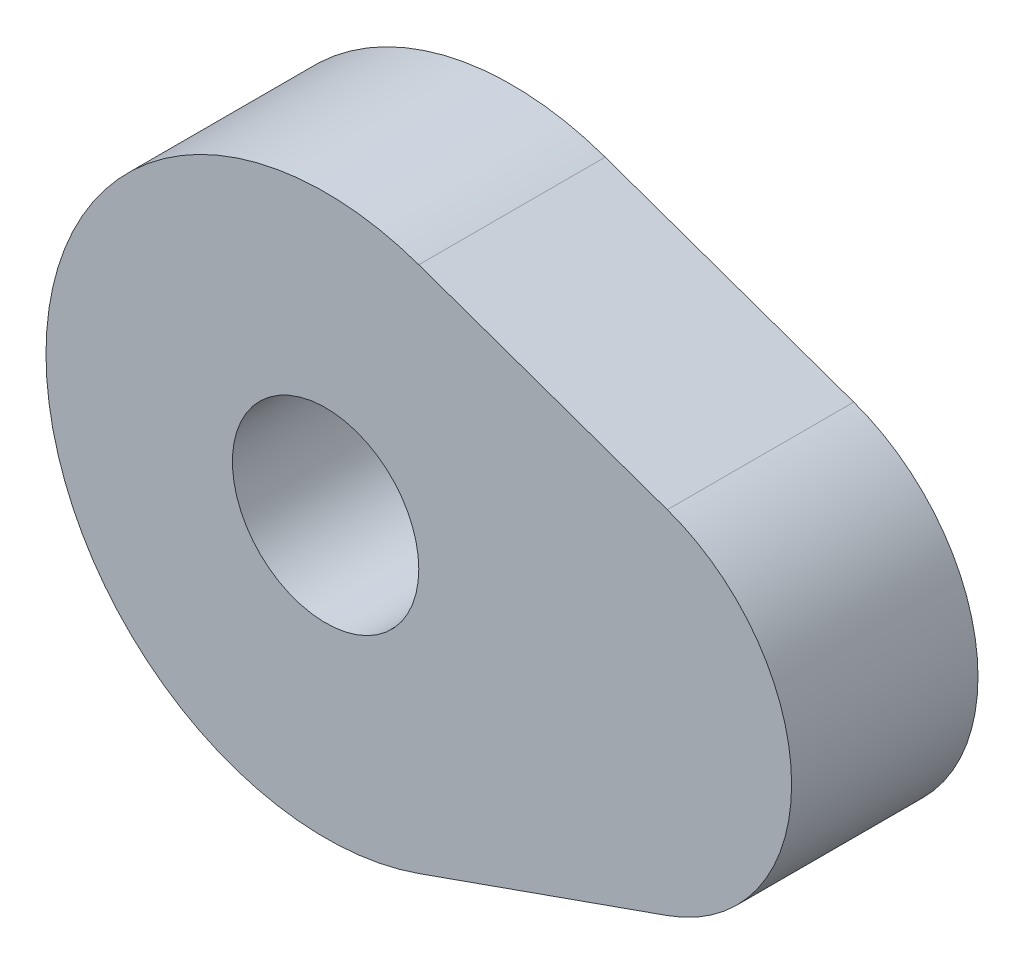
ISO-10303-21;
HEADER;
FILE_DESCRIPTION(('STEP AP214'),'2;1');
FILE_NAME('part.step','',(''),(''),'','','');
FILE_SCHEMA(('AUTOMOTIVE_DESIGN { 1 0 10303 214 1 1 1 1 }'));
ENDSEC;
DATA;
#1=APPLICATION_CONTEXT('core data for automotive mechanical design processes');
#2=APPLICATION_PROTOCOL_DEFINITION('international standard','automotive_design',2000,#1);
#3=PRODUCT_CONTEXT('',#1,'mechanical');
#4=PRODUCT('Part','Part','',(#3));
#5=PRODUCT_RELATED_PRODUCT_CATEGORY('part','',(#4));
#6=PRODUCT_DEFINITION_FORMATION('','',#4);
#7=PRODUCT_DEFINITION_CONTEXT('part definition',#1,'design');
#8=PRODUCT_DEFINITION('design','',#6,#7);
#9=PRODUCT_DEFINITION_SHAPE('','',#8);
#10=(LENGTH_UNIT() NAMED_UNIT(*) SI_UNIT(.MILLI.,.METRE.));
#11=(NAMED_UNIT(*) PLANE_ANGLE_UNIT() SI_UNIT($,.RADIAN.));
#12=(NAMED_UNIT(*) SI_UNIT($,.STERADIAN.) SOLID_ANGLE_UNIT());
#13=UNCERTAINTY_MEASURE_WITH_UNIT(LENGTH_MEASURE(1.E-05),#10,'distance_accuracy_value','');
#14=(GEOMETRIC_REPRESENTATION_CONTEXT(3) GLOBAL_UNCERTAINTY_ASSIGNED_CONTEXT((#13)) GLOBAL_UNIT_ASSIGNED_CONTEXT((#10,
#11,#12)) REPRESENTATION_CONTEXT('',''));
#15=CARTESIAN_POINT('',(0.,0.,0.));
#16=DIRECTION('',(0.,0.,1.));
#17=DIRECTION('',(1.,0.,0.));
#18=AXIS2_PLACEMENT_3D('',#15,#16,#17);
#19=CARTESIAN_POINT('',(0.,0.,10.));
#20=DIRECTION('',(0.,0.,-1.));
#21=DIRECTION('',(-1.,0.,0.));
#22=AXIS2_PLACEMENT_3D('',#19,#20,#21);
#23=CYLINDRICAL_SURFACE('',#22,15.);
#24=CARTESIAN_POINT('',(0.,0.,0.));
#25=DIRECTION('',(0.,0.,1.));
#26=DIRECTION('',(1.,0.,0.));
#27=AXIS2_PLACEMENT_3D('',#24,#25,#26);
#28=CIRCLE('',#27,15.);
#29=CARTESIAN_POINT('',(5.,14.142135623731,0.));
#30=VERTEX_POINT('',#29);
#31=CARTESIAN_POINT('',(5.,-14.142135623731,0.));
#32=VERTEX_POINT('',#31);
#33=EDGE_CURVE('E106',#30,#32,#28,.T.);
#34=ORIENTED_EDGE('',*,*,#33,.T.);
#35=DIRECTION('',(0.,0.,-1.));
#36=VECTOR('',#35,1.);
#37=CARTESIAN_POINT('',(5.,-14.142135623731,10.));
#38=LINE('',#37,#36);
#39=CARTESIAN_POINT('',(5.,-14.142135623731,10.));
#40=VERTEX_POINT('',#39);
#41=EDGE_CURVE('E11',#40,#32,#38,.T.);
#42=ORIENTED_EDGE('',*,*,#41,.F.);
#43=CARTESIAN_POINT('',(0.,0.,10.));
#44=DIRECTION('',(0.,0.,1.));
#45=DIRECTION('',(1.,0.,0.));
#46=AXIS2_PLACEMENT_3D('',#43,#44,#45);
#47=CIRCLE('',#46,15.);
#48=CARTESIAN_POINT('',(5.,14.142135623731,10.));
#49=VERTEX_POINT('',#48);
#50=EDGE_CURVE('E90',#49,#40,#47,.T.);
#51=ORIENTED_EDGE('',*,*,#50,.F.);
#52=DIRECTION('',(0.,0.,-1.));
#53=VECTOR('',#52,1.);
#54=CARTESIAN_POINT('',(5.,14.142135623731,10.));
#55=LINE('',#54,#53);
#56=EDGE_CURVE('E102',#49,#30,#55,.T.);
#57=ORIENTED_EDGE('',*,*,#56,.T.);
#58=EDGE_LOOP('',(#34,#42,#51,#57));
#59=FACE_BOUND('',#58,.T.);
#60=ADVANCED_FACE('F38',(#59),#23,.T.);
#61=CARTESIAN_POINT('',(5.,-14.142135623731,10.));
#62=DIRECTION('',(-0.333333333333334,0.942809041582063,0.));
#63=DIRECTION('',(-0.942809041582063,-0.333333333333334,0.));
#64=AXIS2_PLACEMENT_3D('',#61,#62,#63);
#65=PLANE('',#64);
#66=DIRECTION('',(0.942809041582063,0.333333333333334,0.));
#67=VECTOR('',#66,1.);
#68=CARTESIAN_POINT('',(5.,-14.142135623731,0.));
#69=LINE('',#68,#67);
#70=CARTESIAN_POINT('',(18.3333333333333,-9.42809041582064,0.));
#71=VERTEX_POINT('',#70);
#72=EDGE_CURVE('E95',#32,#71,#69,.T.);
#73=ORIENTED_EDGE('',*,*,#72,.T.);
#74=DIRECTION('',(0.,0.,-1.));
#75=VECTOR('',#74,1.);
#76=CARTESIAN_POINT('',(18.3333333333333,-9.42809041582064,10.));
#77=LINE('',#76,#75);
#78=CARTESIAN_POINT('',(18.3333333333333,-9.42809041582064,10.));
#79=VERTEX_POINT('',#78);
#80=EDGE_CURVE('E47',#79,#71,#77,.T.);
#81=ORIENTED_EDGE('',*,*,#80,.F.);
#82=DIRECTION('',(0.942809041582063,0.333333333333334,0.));
#83=VECTOR('',#82,1.);
#84=CARTESIAN_POINT('',(5.,-14.142135623731,10.));
#85=LINE('',#84,#83);
#86=EDGE_CURVE('E85',#40,#79,#85,.T.);
#87=ORIENTED_EDGE('',*,*,#86,.F.);
#88=ORIENTED_EDGE('',*,*,#41,.T.);
#89=EDGE_LOOP('',(#73,#81,#87,#88));
#90=FACE_BOUND('',#89,.T.);
#91=ADVANCED_FACE('F94',(#90),#65,.F.);
#92=CARTESIAN_POINT('',(15.,0.,10.));
#93=DIRECTION('',(0.,0.,-1.));
#94=DIRECTION('',(-1.,0.,0.));
#95=AXIS2_PLACEMENT_3D('',#92,#93,#94);
#96=CYLINDRICAL_SURFACE('',#95,10.);
#97=CARTESIAN_POINT('',(15.,0.,0.));
#98=DIRECTION('',(0.,0.,1.));
#99=DIRECTION('',(1.,0.,0.));
#100=AXIS2_PLACEMENT_3D('',#97,#98,#99);
#101=CIRCLE('',#100,10.);
#102=CARTESIAN_POINT('',(18.3333333333333,9.42809041582064,0.));
#103=VERTEX_POINT('',#102);
#104=EDGE_CURVE('E72',#71,#103,#101,.T.);
#105=ORIENTED_EDGE('',*,*,#104,.T.);
#106=DIRECTION('',(0.,0.,-1.));
#107=VECTOR('',#106,1.);
#108=CARTESIAN_POINT('',(18.3333333333333,9.42809041582064,10.));
#109=LINE('',#108,#107);
#110=CARTESIAN_POINT('',(18.3333333333333,9.42809041582064,10.));
#111=VERTEX_POINT('',#110);
#112=EDGE_CURVE('E97',#111,#103,#109,.T.);
#113=ORIENTED_EDGE('',*,*,#112,.F.);
#114=CARTESIAN_POINT('',(15.,0.,10.));
#115=DIRECTION('',(0.,0.,1.));
#116=DIRECTION('',(1.,0.,0.));
#117=AXIS2_PLACEMENT_3D('',#114,#115,#116);
#118=CIRCLE('',#117,10.);
#119=EDGE_CURVE('E88',#79,#111,#118,.T.);
#120=ORIENTED_EDGE('',*,*,#119,.F.);
#121=ORIENTED_EDGE('',*,*,#80,.T.);
#122=EDGE_LOOP('',(#105,#113,#120,#121));
#123=FACE_BOUND('',#122,.T.);
#124=ADVANCED_FACE('F98',(#123),#96,.T.);
#125=CARTESIAN_POINT('',(5.,14.142135623731,10.));
#126=DIRECTION('',(-0.333333333333333,-0.942809041582063,0.));
#127=DIRECTION('',(0.942809041582063,-0.333333333333333,0.));
#128=AXIS2_PLACEMENT_3D('',#125,#126,#127);
#129=PLANE('',#128);
#130=DIRECTION('',(-0.942809041582063,0.333333333333333,0.));
#131=VECTOR('',#130,1.);
#132=CARTESIAN_POINT('',(5.,14.142135623731,0.));
#133=LINE('',#132,#131);
#134=EDGE_CURVE('E78',#103,#30,#133,.T.);
#135=ORIENTED_EDGE('',*,*,#134,.T.);
#136=ORIENTED_EDGE('',*,*,#56,.F.);
#137=DIRECTION('',(-0.942809041582063,0.333333333333333,0.));
#138=VECTOR('',#137,1.);
#139=CARTESIAN_POINT('',(5.,14.142135623731,10.));
#140=LINE('',#139,#138);
#141=EDGE_CURVE('E55',#111,#49,#140,.T.);
#142=ORIENTED_EDGE('',*,*,#141,.F.);
#143=ORIENTED_EDGE('',*,*,#112,.T.);
#144=EDGE_LOOP('',(#135,#136,#142,#143));
#145=FACE_BOUND('',#144,.T.);
#146=ADVANCED_FACE('F120',(#145),#129,.F.);
#147=CARTESIAN_POINT('',(0.,0.,10.));
#148=DIRECTION('',(0.,0.,1.));
#149=DIRECTION('',(1.,0.,0.));
#150=AXIS2_PLACEMENT_3D('',#147,#148,#149);
#151=PLANE('',#150);
#152=CARTESIAN_POINT('',(0.,0.,10.));
#153=DIRECTION('',(0.,0.,1.));
#154=DIRECTION('',(1.,0.,0.));
#155=AXIS2_PLACEMENT_3D('',#152,#153,#154);
#156=CIRCLE('',#155,5.);
#157=CARTESIAN_POINT('',(5.,0.,10.));
#158=VERTEX_POINT('',#157);
#159=EDGE_CURVE('E127',#158,#158,#156,.T.);
#160=ORIENTED_EDGE('',*,*,#159,.F.);
#161=EDGE_LOOP('',(#160));
#162=FACE_BOUND('',#161,.T.);
#163=ORIENTED_EDGE('',*,*,#50,.T.);
#164=ORIENTED_EDGE('',*,*,#86,.T.);
#165=ORIENTED_EDGE('',*,*,#119,.T.);
#166=ORIENTED_EDGE('',*,*,#141,.T.);
#167=EDGE_LOOP('',(#163,#164,#165,#166));
#168=FACE_BOUND('',#167,.T.);
#169=ADVANCED_FACE('F86',(#162,#168),#151,.T.);
#170=CARTESIAN_POINT('',(0.,0.,0.));
#171=DIRECTION('',(0.,0.,1.));
#172=DIRECTION('',(1.,0.,0.));
#173=AXIS2_PLACEMENT_3D('',#170,#171,#172);
#174=PLANE('',#173);
#175=CARTESIAN_POINT('',(0.,0.,0.));
#176=DIRECTION('',(0.,0.,1.));
#177=DIRECTION('',(1.,0.,0.));
#178=AXIS2_PLACEMENT_3D('',#175,#176,#177);
#179=CIRCLE('',#178,5.);
#180=CARTESIAN_POINT('',(5.,0.,0.));
#181=VERTEX_POINT('',#180);
#182=EDGE_CURVE('E110',#181,#181,#179,.T.);
#183=ORIENTED_EDGE('',*,*,#182,.T.);
#184=EDGE_LOOP('',(#183));
#185=FACE_BOUND('',#184,.T.);
#186=ORIENTED_EDGE('',*,*,#33,.F.);
#187=ORIENTED_EDGE('',*,*,#134,.F.);
#188=ORIENTED_EDGE('',*,*,#104,.F.);
#189=ORIENTED_EDGE('',*,*,#72,.F.);
#190=EDGE_LOOP('',(#186,#187,#188,#189));
#191=FACE_BOUND('',#190,.T.);
#192=ADVANCED_FACE('F123',(#185,#191),#174,.F.);
#193=CARTESIAN_POINT('',(0.,0.,0.));
#194=DIRECTION('',(0.,0.,1.));
#195=DIRECTION('',(1.,0.,0.));
#196=AXIS2_PLACEMENT_3D('',#193,#194,#195);
#197=CYLINDRICAL_SURFACE('',#196,5.);
#198=ORIENTED_EDGE('',*,*,#182,.F.);
#199=EDGE_LOOP('',(#198));
#200=FACE_BOUND('',#199,.T.);
#201=ORIENTED_EDGE('',*,*,#159,.T.);
#202=EDGE_LOOP('',(#201));
#203=FACE_BOUND('',#202,.T.);
#204=ADVANCED_FACE('F136',(#200,#203),#197,.F.);
#205=CLOSED_SHELL('',(#60,#91,#124,#146,#169,#192,#204));
#206=MANIFOLD_SOLID_BREP('B2',#205);
#207=ADVANCED_BREP_SHAPE_REPRESENTATION('',(#18,#206),#14);
#208=SHAPE_DEFINITION_REPRESENTATION(#9,#207);
ENDSEC;
END-ISO-10303-21;
